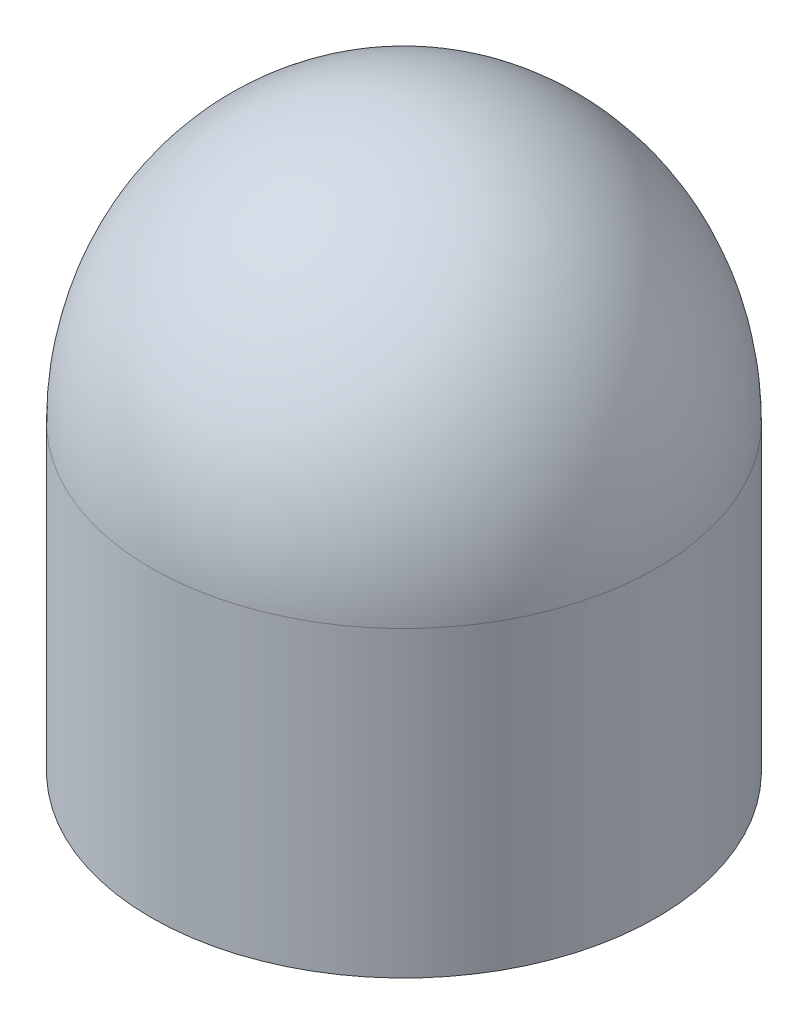
ISO-10303-21;
HEADER;
FILE_DESCRIPTION(('STEP AP214'),'2;1');
FILE_NAME('part.step','',(''),(''),'','','');
FILE_SCHEMA(('AUTOMOTIVE_DESIGN { 1 0 10303 214 1 1 1 1 }'));
ENDSEC;
DATA;
#1=APPLICATION_CONTEXT('core data for automotive mechanical design processes');
#2=APPLICATION_PROTOCOL_DEFINITION('international standard','automotive_design',2000,#1);
#3=PRODUCT_CONTEXT('',#1,'mechanical');
#4=PRODUCT('Part','Part','',(#3));
#5=PRODUCT_RELATED_PRODUCT_CATEGORY('part','',(#4));
#6=PRODUCT_DEFINITION_FORMATION('','',#4);
#7=PRODUCT_DEFINITION_CONTEXT('part definition',#1,'design');
#8=PRODUCT_DEFINITION('design','',#6,#7);
#9=PRODUCT_DEFINITION_SHAPE('','',#8);
#10=(LENGTH_UNIT() NAMED_UNIT(*) SI_UNIT(.MILLI.,.METRE.));
#11=(NAMED_UNIT(*) PLANE_ANGLE_UNIT() SI_UNIT($,.RADIAN.));
#12=(NAMED_UNIT(*) SI_UNIT($,.STERADIAN.) SOLID_ANGLE_UNIT());
#13=UNCERTAINTY_MEASURE_WITH_UNIT(LENGTH_MEASURE(1.E-05),#10,'distance_accuracy_value','');
#14=(GEOMETRIC_REPRESENTATION_CONTEXT(3) GLOBAL_UNCERTAINTY_ASSIGNED_CONTEXT((#13)) GLOBAL_UNIT_ASSIGNED_CONTEXT((#10,
#11,#12)) REPRESENTATION_CONTEXT('',''));
#15=CARTESIAN_POINT('',(0.,0.,0.));
#16=DIRECTION('',(0.,0.,1.));
#17=DIRECTION('',(1.,0.,0.));
#18=AXIS2_PLACEMENT_3D('',#15,#16,#17);
#19=CARTESIAN_POINT('',(0.,17.9999999999998,0.));
#20=DIRECTION('',(0.,1.,0.));
#21=DIRECTION('',(0.,0.,1.));
#22=AXIS2_PLACEMENT_3D('',#19,#20,#21);
#23=CYLINDRICAL_SURFACE('',#22,16.7);
#24=CARTESIAN_POINT('',(0.,-20.,0.));
#25=DIRECTION('',(0.,1.,0.));
#26=DIRECTION('',(0.,0.,1.));
#27=AXIS2_PLACEMENT_3D('',#24,#25,#26);
#28=CIRCLE('',#27,16.7);
#29=CARTESIAN_POINT('',(0.,-20.,16.7));
#30=VERTEX_POINT('',#29);
#31=EDGE_CURVE('E68',#30,#30,#28,.T.);
#32=ORIENTED_EDGE('',*,*,#31,.T.);
#33=EDGE_LOOP('',(#32));
#34=FACE_BOUND('',#33,.T.);
#35=CARTESIAN_POINT('',(0.,0.,0.));
#36=DIRECTION('',(0.,1.,0.));
#37=DIRECTION('',(0.,0.,1.));
#38=AXIS2_PLACEMENT_3D('',#35,#36,#37);
#39=CIRCLE('',#38,16.7);
#40=CARTESIAN_POINT('',(0.,0.,16.7));
#41=VERTEX_POINT('',#40);
#42=EDGE_CURVE('E11',#41,#41,#39,.T.);
#43=ORIENTED_EDGE('',*,*,#42,.F.);
#44=EDGE_LOOP('',(#43));
#45=FACE_BOUND('',#44,.T.);
#46=ADVANCED_FACE('F32',(#34,#45),#23,.T.);
#47=CARTESIAN_POINT('',(0.,0.,0.));
#48=DIRECTION('',(0.,0.,1.));
#49=DIRECTION('',(0.,-1.,0.));
#50=AXIS2_PLACEMENT_3D('',#47,#48,#49);
#51=ELLIPSE('',#50,18.,16.7);
#52=TRIMMED_CURVE('',#51,(PARAMETER_VALUE(3.14159265358979)),
(PARAMETER_VALUE(6.28318530717959)),.T.,.PARAMETER.);
#53=CARTESIAN_POINT('',(0.,17.9999999999998,0.));
#54=DIRECTION('',(0.,1.,0.));
#55=AXIS1_PLACEMENT('',#53,#54);
#56=SURFACE_OF_REVOLUTION('',#52,#55);
#57=ORIENTED_EDGE('',*,*,#42,.T.);
#58=EDGE_LOOP('',(#57));
#59=FACE_BOUND('',#58,.T.);
#60=CARTESIAN_POINT('',(0.,17.9999999999998,0.));
#61=VERTEX_POINT('',#60);
#62=VERTEX_LOOP('',#61);
#63=FACE_BOUND('',#62,.T.);
#64=ADVANCED_FACE('F48',(#59,#63),#56,.F.);
#65=CARTESIAN_POINT('',(0.,14.6000000000002,0.));
#66=CARTESIAN_POINT('',(-1.7063206206589,14.6000000000002,1.11022302462516E-13));
#67=CARTESIAN_POINT('',(-3.41299693139874,14.2358357782637,1.11022302462516E-13));
#68=CARTESIAN_POINT('',(-6.59645301991096,12.8145571933862,0.));
#69=CARTESIAN_POINT('',(-8.07229946730725,11.7561810623203,1.11022302462516E-13));
#70=CARTESIAN_POINT('',(-9.93814911071844,9.74508563828413,-1.11022302462516E-13));
#71=CARTESIAN_POINT('',(-10.5021918848376,9.00503087260107,0.));
#72=CARTESIAN_POINT('',(-11.4893511472736,7.412636361527,-1.11022302462516E-13));
#73=CARTESIAN_POINT('',(-11.9124004546118,6.56034173856046,-1.11022302462516E-13));
#74=CARTESIAN_POINT('',(-12.59775135946,4.77695837985159,0.));
#75=CARTESIAN_POINT('',(-12.860005480646,3.84593649383769,-1.11022302462516E-13));
#76=CARTESIAN_POINT('',(-13.2111418044318,1.94323786280082,-2.22044604925031E-13));
#77=CARTESIAN_POINT('',(-13.300000000001,0.9716393389958,0.));
#78=CARTESIAN_POINT('',(-13.300000000001,0.,0.));
#79=B_SPLINE_CURVE_WITH_KNOTS('',3,(#65,#66,#67,#68,#69,#70,#71,#72,#73,#74,#75,#76,#77,#78),
.UNSPECIFIED.,.F.,.F.,(4,2,2,2,2,2,4),(0.,0.25,0.5,0.625,0.75,0.875,1.),.UNSPECIFIED.);
#80=CARTESIAN_POINT('',(0.,17.9999999999998,0.));
#81=DIRECTION('',(0.,1.,0.));
#82=AXIS1_PLACEMENT('',#80,#81);
#83=SURFACE_OF_REVOLUTION('',#79,#82);
#84=CARTESIAN_POINT('',(0.,0.,0.));
#85=DIRECTION('',(0.,1.,0.));
#86=DIRECTION('',(0.,0.,1.));
#87=AXIS2_PLACEMENT_3D('',#84,#85,#86);
#88=CIRCLE('',#87,13.3);
#89=CARTESIAN_POINT('',(0.,0.,13.3));
#90=VERTEX_POINT('',#89);
#91=EDGE_CURVE('E39',#90,#90,#88,.T.);
#92=ORIENTED_EDGE('',*,*,#91,.F.);
#93=EDGE_LOOP('',(#92));
#94=FACE_BOUND('',#93,.T.);
#95=CARTESIAN_POINT('',(0.,14.6000000000002,0.));
#96=VERTEX_POINT('',#95);
#97=VERTEX_LOOP('',#96);
#98=FACE_BOUND('',#97,.T.);
#99=ADVANCED_FACE('F45',(#94,#98),#83,.T.);
#100=CARTESIAN_POINT('',(0.,17.9999999999998,0.));
#101=DIRECTION('',(0.,1.,0.));
#102=DIRECTION('',(0.,0.,1.));
#103=AXIS2_PLACEMENT_3D('',#100,#101,#102);
#104=CYLINDRICAL_SURFACE('',#103,13.3);
#105=CARTESIAN_POINT('',(0.,-20.,0.));
#106=DIRECTION('',(0.,1.,0.));
#107=DIRECTION('',(0.,0.,1.));
#108=AXIS2_PLACEMENT_3D('',#105,#106,#107);
#109=CIRCLE('',#108,13.3);
#110=CARTESIAN_POINT('',(0.,-20.,13.3));
#111=VERTEX_POINT('',#110);
#112=EDGE_CURVE('E71',#111,#111,#109,.T.);
#113=ORIENTED_EDGE('',*,*,#112,.F.);
#114=EDGE_LOOP('',(#113));
#115=FACE_BOUND('',#114,.T.);
#116=ORIENTED_EDGE('',*,*,#91,.T.);
#117=EDGE_LOOP('',(#116));
#118=FACE_BOUND('',#117,.T.);
#119=ADVANCED_FACE('F47',(#115,#118),#104,.F.);
#120=CARTESIAN_POINT('',(-13.3000000000005,-20.,0.));
#121=DIRECTION('',(0.,1.,0.));
#122=DIRECTION('',(0.,0.,1.));
#123=AXIS2_PLACEMENT_3D('',#120,#121,#122);
#124=PLANE('',#123);
#125=ORIENTED_EDGE('',*,*,#31,.F.);
#126=EDGE_LOOP('',(#125));
#127=FACE_BOUND('',#126,.T.);
#128=ORIENTED_EDGE('',*,*,#112,.T.);
#129=EDGE_LOOP('',(#128));
#130=FACE_BOUND('',#129,.T.);
#131=ADVANCED_FACE('F55',(#127,#130),#124,.F.);
#132=CLOSED_SHELL('',(#46,#64,#99,#119,#131));
#133=MANIFOLD_SOLID_BREP('B2',#132);
#134=ADVANCED_BREP_SHAPE_REPRESENTATION('',(#18,#133),#14);
#135=SHAPE_DEFINITION_REPRESENTATION(#9,#134);
ENDSEC;
END-ISO-10303-21;
